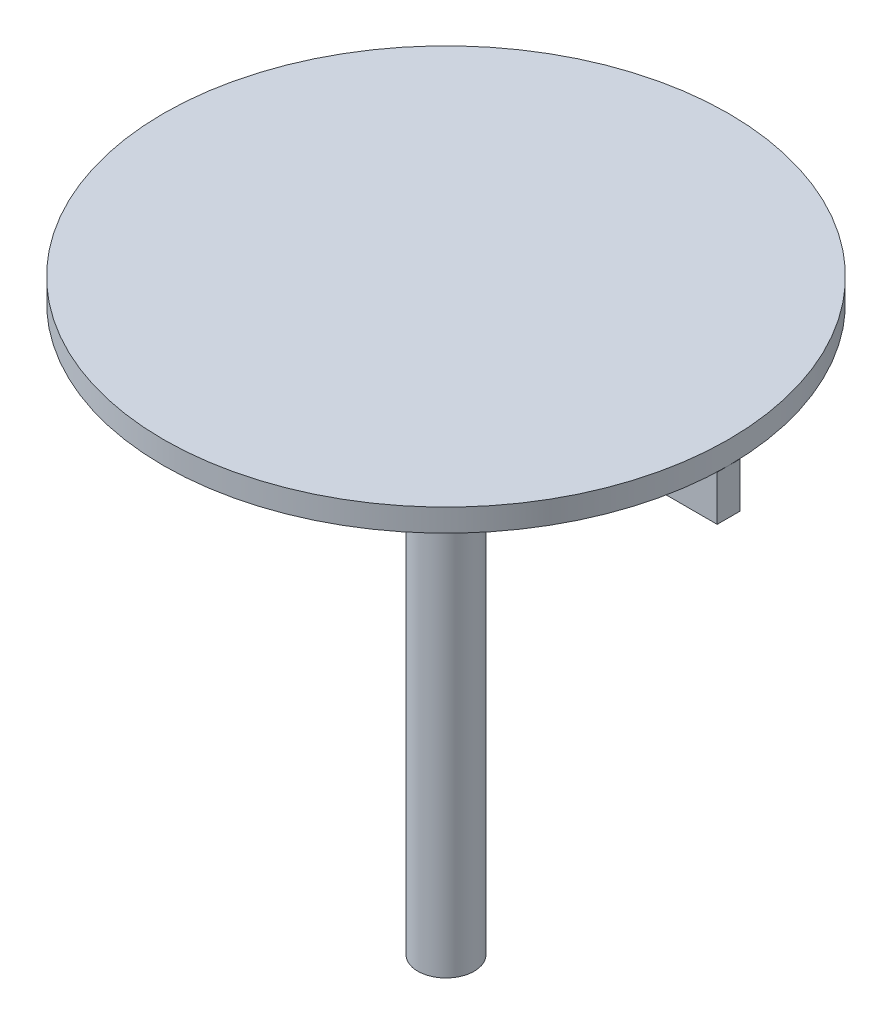
ISO-10303-21;
HEADER;
FILE_DESCRIPTION(('STEP AP214'),'2;1');
FILE_NAME('part.step','',(''),(''),'','','');
FILE_SCHEMA(('AUTOMOTIVE_DESIGN { 1 0 10303 214 1 1 1 1 }'));
ENDSEC;
DATA;
#1=APPLICATION_CONTEXT('core data for automotive mechanical design processes');
#2=APPLICATION_PROTOCOL_DEFINITION('international standard','automotive_design',2000,#1);
#3=PRODUCT_CONTEXT('',#1,'mechanical');
#4=PRODUCT('Part','Part','',(#3));
#5=PRODUCT_RELATED_PRODUCT_CATEGORY('part','',(#4));
#6=PRODUCT_DEFINITION_FORMATION('','',#4);
#7=PRODUCT_DEFINITION_CONTEXT('part definition',#1,'design');
#8=PRODUCT_DEFINITION('design','',#6,#7);
#9=PRODUCT_DEFINITION_SHAPE('','',#8);
#10=(LENGTH_UNIT() NAMED_UNIT(*) SI_UNIT(.MILLI.,.METRE.));
#11=(NAMED_UNIT(*) PLANE_ANGLE_UNIT() SI_UNIT($,.RADIAN.));
#12=(NAMED_UNIT(*) SI_UNIT($,.STERADIAN.) SOLID_ANGLE_UNIT());
#13=UNCERTAINTY_MEASURE_WITH_UNIT(LENGTH_MEASURE(1.E-05),#10,'distance_accuracy_value','');
#14=(GEOMETRIC_REPRESENTATION_CONTEXT(3) GLOBAL_UNCERTAINTY_ASSIGNED_CONTEXT((#13)) GLOBAL_UNIT_ASSIGNED_CONTEXT((#10,
#11,#12)) REPRESENTATION_CONTEXT('',''));
#15=CARTESIAN_POINT('',(0.,0.,0.));
#16=DIRECTION('',(0.,0.,1.));
#17=DIRECTION('',(1.,0.,0.));
#18=AXIS2_PLACEMENT_3D('',#15,#16,#17);
#19=CARTESIAN_POINT('',(0.,0.,0.));
#20=DIRECTION('',(0.,-1.,0.));
#21=DIRECTION('',(1.,0.,0.));
#22=AXIS2_PLACEMENT_3D('',#19,#20,#21);
#23=CYLINDRICAL_SURFACE('',#22,25.);
#24=CARTESIAN_POINT('',(0.,-500.,0.));
#25=DIRECTION('',(0.,-1.,0.));
#26=DIRECTION('',(1.,0.,0.));
#27=AXIS2_PLACEMENT_3D('',#24,#25,#26);
#28=CIRCLE('',#27,25.);
#29=CARTESIAN_POINT('',(-25.,-500.,0.));
#30=VERTEX_POINT('',#29);
#31=EDGE_CURVE('P0_E27',#30,#30,#28,.T.);
#32=ORIENTED_EDGE('',*,*,#31,.F.);
#33=DIRECTION('',(0.,1.,0.));
#34=VECTOR('',#33,1.);
#35=CARTESIAN_POINT('',(-25.,0.,0.));
#36=LINE('',#35,#34);
#37=CARTESIAN_POINT('',(-25.,0.,0.));
#38=VERTEX_POINT('',#37);
#39=EDGE_CURVE('P0_E11',#30,#38,#36,.T.);
#40=ORIENTED_EDGE('',*,*,#39,.T.);
#41=CARTESIAN_POINT('',(0.,0.,0.));
#42=DIRECTION('',(0.,1.,0.));
#43=DIRECTION('',(1.,0.,0.));
#44=AXIS2_PLACEMENT_3D('',#41,#42,#43);
#45=CIRCLE('',#44,25.);
#46=EDGE_CURVE('P0_E46',#38,#38,#45,.T.);
#47=ORIENTED_EDGE('',*,*,#46,.F.);
#48=ORIENTED_EDGE('',*,*,#39,.F.);
#49=EDGE_LOOP('',(#32,#40,#47,#48));
#50=FACE_BOUND('',#49,.T.);
#51=ADVANCED_FACE('P0_F17',(#50),#23,.T.);
#52=CARTESIAN_POINT('',(0.,-500.,0.));
#53=DIRECTION('',(0.,1.,0.));
#54=DIRECTION('',(1.,0.,0.));
#55=AXIS2_PLACEMENT_3D('',#52,#53,#54);
#56=PLANE('',#55);
#57=ORIENTED_EDGE('',*,*,#31,.T.);
#58=EDGE_LOOP('',(#57));
#59=FACE_BOUND('',#58,.T.);
#60=ADVANCED_FACE('P0_F88',(#59),#56,.F.);
#61=CARTESIAN_POINT('',(0.,0.,0.));
#62=DIRECTION('',(0.,1.,0.));
#63=DIRECTION('',(1.,0.,0.));
#64=AXIS2_PLACEMENT_3D('',#61,#62,#63);
#65=CYLINDRICAL_SURFACE('',#64,250.);
#66=CARTESIAN_POINT('',(0.,20.,0.));
#67=DIRECTION('',(0.,1.,0.));
#68=DIRECTION('',(1.,0.,0.));
#69=AXIS2_PLACEMENT_3D('',#66,#67,#68);
#70=CIRCLE('',#69,250.);
#71=CARTESIAN_POINT('',(-250.,20.,0.));
#72=VERTEX_POINT('',#71);
#73=EDGE_CURVE('P0_E21',#72,#72,#70,.T.);
#74=ORIENTED_EDGE('',*,*,#73,.F.);
#75=DIRECTION('',(0.,-1.,0.));
#76=VECTOR('',#75,1.);
#77=CARTESIAN_POINT('',(-250.,0.,0.));
#78=LINE('',#77,#76);
#79=CARTESIAN_POINT('',(-250.,0.,0.));
#80=VERTEX_POINT('',#79);
#81=EDGE_CURVE('P0_E60',#72,#80,#78,.T.);
#82=ORIENTED_EDGE('',*,*,#81,.T.);
#83=CARTESIAN_POINT('',(0.,0.,0.));
#84=DIRECTION('',(0.,1.,0.));
#85=DIRECTION('',(1.,0.,0.));
#86=AXIS2_PLACEMENT_3D('',#83,#84,#85);
#87=CIRCLE('',#86,250.);
#88=EDGE_CURVE('P0_E54',#80,#80,#87,.T.);
#89=ORIENTED_EDGE('',*,*,#88,.T.);
#90=ORIENTED_EDGE('',*,*,#81,.F.);
#91=EDGE_LOOP('',(#74,#82,#89,#90));
#92=FACE_BOUND('',#91,.T.);
#93=ADVANCED_FACE('P0_F62',(#92),#65,.T.);
#94=CARTESIAN_POINT('',(0.,20.,0.));
#95=DIRECTION('',(0.,1.,0.));
#96=DIRECTION('',(1.,0.,0.));
#97=AXIS2_PLACEMENT_3D('',#94,#95,#96);
#98=PLANE('',#97);
#99=ORIENTED_EDGE('',*,*,#73,.T.);
#100=EDGE_LOOP('',(#99));
#101=FACE_BOUND('',#100,.T.);
#102=ADVANCED_FACE('P0_F79',(#101),#98,.T.);
#103=CARTESIAN_POINT('',(0.,0.,0.));
#104=DIRECTION('',(0.,1.,0.));
#105=DIRECTION('',(1.,0.,0.));
#106=AXIS2_PLACEMENT_3D('',#103,#104,#105);
#107=PLANE('',#106);
#108=ORIENTED_EDGE('',*,*,#88,.F.);
#109=EDGE_LOOP('',(#108));
#110=FACE_BOUND('',#109,.T.);
#111=ORIENTED_EDGE('',*,*,#46,.T.);
#112=EDGE_LOOP('',(#111));
#113=FACE_BOUND('',#112,.T.);
#114=ADVANCED_FACE('P0_F19',(#110,#113),#107,.F.);
#115=CLOSED_SHELL('',(#51,#60,#93,#102,#114));
#116=MANIFOLD_SOLID_BREP('P0_B1',#115);
#117=CARTESIAN_POINT('',(250.,0.,10.));
#118=DIRECTION('',(0.,0.,1.));
#119=DIRECTION('',(1.,0.,0.));
#120=AXIS2_PLACEMENT_3D('',#117,#118,#119);
#121=PLANE('',#120);
#122=DIRECTION('',(1.,0.,0.));
#123=VECTOR('',#122,1.);
#124=CARTESIAN_POINT('',(25.,0.,10.));
#125=LINE('',#124,#123);
#126=CARTESIAN_POINT('',(25.,0.,10.));
#127=VERTEX_POINT('',#126);
#128=CARTESIAN_POINT('',(250.,0.,10.));
#129=VERTEX_POINT('',#128);
#130=EDGE_CURVE('P1_E40',#127,#129,#125,.T.);
#131=ORIENTED_EDGE('',*,*,#130,.F.);
#132=DIRECTION('',(0.,-1.,0.));
#133=VECTOR('',#132,1.);
#134=CARTESIAN_POINT('',(25.,0.,10.));
#135=LINE('',#134,#133);
#136=CARTESIAN_POINT('',(25.,-40.,10.));
#137=VERTEX_POINT('',#136);
#138=EDGE_CURVE('P1_E10',#127,#137,#135,.T.);
#139=ORIENTED_EDGE('',*,*,#138,.T.);
#140=DIRECTION('',(-1.,0.,0.));
#141=VECTOR('',#140,1.);
#142=CARTESIAN_POINT('',(25.,-40.,10.));
#143=LINE('',#142,#141);
#144=CARTESIAN_POINT('',(250.,-40.,10.));
#145=VERTEX_POINT('',#144);
#146=EDGE_CURVE('P1_E89',#145,#137,#143,.T.);
#147=ORIENTED_EDGE('',*,*,#146,.F.);
#148=DIRECTION('',(0.,-1.,0.));
#149=VECTOR('',#148,1.);
#150=CARTESIAN_POINT('',(250.,0.,10.));
#151=LINE('',#150,#149);
#152=EDGE_CURVE('P1_E27',#129,#145,#151,.T.);
#153=ORIENTED_EDGE('',*,*,#152,.F.);
#154=EDGE_LOOP('',(#131,#139,#147,#153));
#155=FACE_BOUND('',#154,.T.);
#156=ADVANCED_FACE('P1_F16',(#155),#121,.T.);
#157=CARTESIAN_POINT('',(250.,0.,-10.));
#158=DIRECTION('',(1.,0.,0.));
#159=DIRECTION('',(0.,1.,0.));
#160=AXIS2_PLACEMENT_3D('',#157,#158,#159);
#161=PLANE('',#160);
#162=DIRECTION('',(0.,0.,-1.));
#163=VECTOR('',#162,1.);
#164=CARTESIAN_POINT('',(250.,0.,10.));
#165=LINE('',#164,#163);
#166=CARTESIAN_POINT('',(250.,0.,-10.));
#167=VERTEX_POINT('',#166);
#168=EDGE_CURVE('P1_E97',#129,#167,#165,.T.);
#169=ORIENTED_EDGE('',*,*,#168,.F.);
#170=ORIENTED_EDGE('',*,*,#152,.T.);
#171=DIRECTION('',(0.,0.,1.));
#172=VECTOR('',#171,1.);
#173=CARTESIAN_POINT('',(250.,-40.,10.));
#174=LINE('',#173,#172);
#175=CARTESIAN_POINT('',(250.,-40.,-10.));
#176=VERTEX_POINT('',#175);
#177=EDGE_CURVE('P1_E80',#176,#145,#174,.T.);
#178=ORIENTED_EDGE('',*,*,#177,.F.);
#179=DIRECTION('',(0.,-1.,0.));
#180=VECTOR('',#179,1.);
#181=CARTESIAN_POINT('',(250.,0.,-10.));
#182=LINE('',#181,#180);
#183=EDGE_CURVE('P1_E74',#167,#176,#182,.T.);
#184=ORIENTED_EDGE('',*,*,#183,.F.);
#185=EDGE_LOOP('',(#169,#170,#178,#184));
#186=FACE_BOUND('',#185,.T.);
#187=ADVANCED_FACE('P1_F135',(#186),#161,.T.);
#188=CARTESIAN_POINT('',(25.,0.,-10.));
#189=DIRECTION('',(0.,0.,-1.));
#190=DIRECTION('',(0.,-1.,0.));
#191=AXIS2_PLACEMENT_3D('',#188,#189,#190);
#192=PLANE('',#191);
#193=DIRECTION('',(-1.,0.,0.));
#194=VECTOR('',#193,1.);
#195=CARTESIAN_POINT('',(250.,0.,-10.));
#196=LINE('',#195,#194);
#197=CARTESIAN_POINT('',(25.,0.,-10.));
#198=VERTEX_POINT('',#197);
#199=EDGE_CURVE('P1_E91',#167,#198,#196,.T.);
#200=ORIENTED_EDGE('',*,*,#199,.F.);
#201=ORIENTED_EDGE('',*,*,#183,.T.);
#202=DIRECTION('',(1.,0.,0.));
#203=VECTOR('',#202,1.);
#204=CARTESIAN_POINT('',(250.,-40.,-10.));
#205=LINE('',#204,#203);
#206=CARTESIAN_POINT('',(25.,-40.,-10.));
#207=VERTEX_POINT('',#206);
#208=EDGE_CURVE('P1_E67',#207,#176,#205,.T.);
#209=ORIENTED_EDGE('',*,*,#208,.F.);
#210=DIRECTION('',(0.,-1.,0.));
#211=VECTOR('',#210,1.);
#212=CARTESIAN_POINT('',(25.,0.,-10.));
#213=LINE('',#212,#211);
#214=EDGE_CURVE('P1_E71',#198,#207,#213,.T.);
#215=ORIENTED_EDGE('',*,*,#214,.F.);
#216=EDGE_LOOP('',(#200,#201,#209,#215));
#217=FACE_BOUND('',#216,.T.);
#218=ADVANCED_FACE('P1_F70',(#217),#192,.T.);
#219=CARTESIAN_POINT('',(25.,0.,10.));
#220=DIRECTION('',(-1.,0.,0.));
#221=DIRECTION('',(0.,0.,1.));
#222=AXIS2_PLACEMENT_3D('',#219,#220,#221);
#223=PLANE('',#222);
#224=DIRECTION('',(0.,0.,1.));
#225=VECTOR('',#224,1.);
#226=CARTESIAN_POINT('',(25.,0.,-10.));
#227=LINE('',#226,#225);
#228=EDGE_CURVE('P1_E20',#198,#127,#227,.T.);
#229=ORIENTED_EDGE('',*,*,#228,.F.);
#230=ORIENTED_EDGE('',*,*,#214,.T.);
#231=DIRECTION('',(0.,0.,-1.));
#232=VECTOR('',#231,1.);
#233=CARTESIAN_POINT('',(25.,-40.,-10.));
#234=LINE('',#233,#232);
#235=EDGE_CURVE('P1_E79',#137,#207,#234,.T.);
#236=ORIENTED_EDGE('',*,*,#235,.F.);
#237=ORIENTED_EDGE('',*,*,#138,.F.);
#238=EDGE_LOOP('',(#229,#230,#236,#237));
#239=FACE_BOUND('',#238,.T.);
#240=ADVANCED_FACE('P1_F84',(#239),#223,.T.);
#241=CARTESIAN_POINT('',(137.5,0.,0.));
#242=DIRECTION('',(0.,1.,0.));
#243=DIRECTION('',(1.,0.,0.));
#244=AXIS2_PLACEMENT_3D('',#241,#242,#243);
#245=PLANE('',#244);
#246=ORIENTED_EDGE('',*,*,#228,.T.);
#247=ORIENTED_EDGE('',*,*,#130,.T.);
#248=ORIENTED_EDGE('',*,*,#168,.T.);
#249=ORIENTED_EDGE('',*,*,#199,.T.);
#250=EDGE_LOOP('',(#246,#247,#248,#249));
#251=FACE_BOUND('',#250,.T.);
#252=ADVANCED_FACE('P1_F18',(#251),#245,.T.);
#253=CARTESIAN_POINT('',(137.5,-40.,0.));
#254=DIRECTION('',(0.,-1.,0.));
#255=DIRECTION('',(0.,0.,-1.));
#256=AXIS2_PLACEMENT_3D('',#253,#254,#255);
#257=PLANE('',#256);
#258=ORIENTED_EDGE('',*,*,#235,.T.);
#259=ORIENTED_EDGE('',*,*,#208,.T.);
#260=ORIENTED_EDGE('',*,*,#177,.T.);
#261=ORIENTED_EDGE('',*,*,#146,.T.);
#262=EDGE_LOOP('',(#258,#259,#260,#261));
#263=FACE_BOUND('',#262,.T.);
#264=ADVANCED_FACE('P1_F88',(#263),#257,.T.);
#265=CLOSED_SHELL('',(#156,#187,#218,#240,#252,#264));
#266=MANIFOLD_SOLID_BREP('P1_B1',#265);
#267=ADVANCED_BREP_SHAPE_REPRESENTATION('',(#18,#116,#266),#14);
#268=SHAPE_DEFINITION_REPRESENTATION(#9,#267);
ENDSEC;
END-ISO-10303-21;
